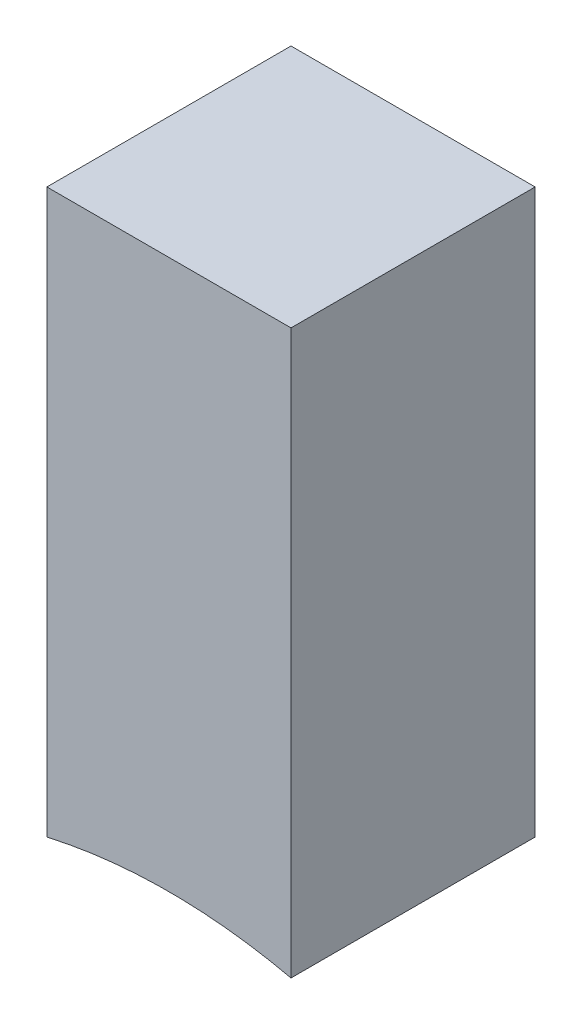
ISO-10303-21;
HEADER;
FILE_DESCRIPTION(('STEP AP214'),'2;1');
FILE_NAME('part.step','',(''),(''),'','','');
FILE_SCHEMA(('AUTOMOTIVE_DESIGN { 1 0 10303 214 1 1 1 1 }'));
ENDSEC;
DATA;
#1=APPLICATION_CONTEXT('core data for automotive mechanical design processes');
#2=APPLICATION_PROTOCOL_DEFINITION('international standard','automotive_design',2000,#1);
#3=PRODUCT_CONTEXT('',#1,'mechanical');
#4=PRODUCT('Part','Part','',(#3));
#5=PRODUCT_RELATED_PRODUCT_CATEGORY('part','',(#4));
#6=PRODUCT_DEFINITION_FORMATION('','',#4);
#7=PRODUCT_DEFINITION_CONTEXT('part definition',#1,'design');
#8=PRODUCT_DEFINITION('design','',#6,#7);
#9=PRODUCT_DEFINITION_SHAPE('','',#8);
#10=(LENGTH_UNIT() NAMED_UNIT(*) SI_UNIT(.MILLI.,.METRE.));
#11=(NAMED_UNIT(*) PLANE_ANGLE_UNIT() SI_UNIT($,.RADIAN.));
#12=(NAMED_UNIT(*) SI_UNIT($,.STERADIAN.) SOLID_ANGLE_UNIT());
#13=UNCERTAINTY_MEASURE_WITH_UNIT(LENGTH_MEASURE(1.E-05),#10,'distance_accuracy_value','');
#14=(GEOMETRIC_REPRESENTATION_CONTEXT(3) GLOBAL_UNCERTAINTY_ASSIGNED_CONTEXT((#13)) GLOBAL_UNIT_ASSIGNED_CONTEXT((#10,
#11,#12)) REPRESENTATION_CONTEXT('',''));
#15=CARTESIAN_POINT('',(0.,0.,0.));
#16=DIRECTION('',(0.,0.,1.));
#17=DIRECTION('',(1.,0.,0.));
#18=AXIS2_PLACEMENT_3D('',#15,#16,#17);
#19=CARTESIAN_POINT('',(2.,5.,4.));
#20=DIRECTION('',(-1.,0.,0.));
#21=DIRECTION('',(0.,-1.,0.));
#22=AXIS2_PLACEMENT_3D('',#19,#20,#21);
#23=PLANE('',#22);
#24=DIRECTION('',(0.,1.,0.));
#25=VECTOR('',#24,1.);
#26=CARTESIAN_POINT('',(2.,5.,4.));
#27=LINE('',#26,#25);
#28=CARTESIAN_POINT('',(2.,-4.22503561260788,4.));
#29=VERTEX_POINT('',#28);
#30=CARTESIAN_POINT('',(2.,5.,4.));
#31=VERTEX_POINT('',#30);
#32=EDGE_CURVE('E85',#29,#31,#27,.T.);
#33=ORIENTED_EDGE('',*,*,#32,.F.);
#34=DIRECTION('',(0.,0.,1.));
#35=VECTOR('',#34,1.);
#36=CARTESIAN_POINT('',(2.,-4.22503561260788,0.));
#37=LINE('',#36,#35);
#38=CARTESIAN_POINT('',(2.,-4.22503561260788,0.));
#39=VERTEX_POINT('',#38);
#40=EDGE_CURVE('E90',#29,#39,#37,.F.);
#41=ORIENTED_EDGE('',*,*,#40,.T.);
#42=DIRECTION('',(0.,1.,0.));
#43=VECTOR('',#42,1.);
#44=CARTESIAN_POINT('',(2.,5.,0.));
#45=LINE('',#44,#43);
#46=CARTESIAN_POINT('',(2.,5.,0.));
#47=VERTEX_POINT('',#46);
#48=EDGE_CURVE('E77',#39,#47,#45,.T.);
#49=ORIENTED_EDGE('',*,*,#48,.T.);
#50=DIRECTION('',(0.,0.,-1.));
#51=VECTOR('',#50,1.);
#52=CARTESIAN_POINT('',(2.,5.,4.));
#53=LINE('',#52,#51);
#54=EDGE_CURVE('E11',#31,#47,#53,.T.);
#55=ORIENTED_EDGE('',*,*,#54,.F.);
#56=EDGE_LOOP('',(#33,#41,#49,#55));
#57=FACE_BOUND('',#56,.T.);
#58=ADVANCED_FACE('F33',(#57),#23,.F.);
#59=CARTESIAN_POINT('',(-2.,5.,4.));
#60=DIRECTION('',(0.,-1.,0.));
#61=DIRECTION('',(0.,0.,-1.));
#62=AXIS2_PLACEMENT_3D('',#59,#60,#61);
#63=PLANE('',#62);
#64=DIRECTION('',(-1.,0.,0.));
#65=VECTOR('',#64,1.);
#66=CARTESIAN_POINT('',(-2.,5.,0.));
#67=LINE('',#66,#65);
#68=CARTESIAN_POINT('',(-2.,5.,0.));
#69=VERTEX_POINT('',#68);
#70=EDGE_CURVE('E68',#47,#69,#67,.T.);
#71=ORIENTED_EDGE('',*,*,#70,.T.);
#72=DIRECTION('',(0.,0.,-1.));
#73=VECTOR('',#72,1.);
#74=CARTESIAN_POINT('',(-2.,5.,4.));
#75=LINE('',#74,#73);
#76=CARTESIAN_POINT('',(-2.,5.,4.));
#77=VERTEX_POINT('',#76);
#78=EDGE_CURVE('E40',#77,#69,#75,.T.);
#79=ORIENTED_EDGE('',*,*,#78,.F.);
#80=DIRECTION('',(-1.,0.,0.));
#81=VECTOR('',#80,1.);
#82=CARTESIAN_POINT('',(-2.,5.,4.));
#83=LINE('',#82,#81);
#84=EDGE_CURVE('E56',#31,#77,#83,.T.);
#85=ORIENTED_EDGE('',*,*,#84,.F.);
#86=ORIENTED_EDGE('',*,*,#54,.T.);
#87=EDGE_LOOP('',(#71,#79,#85,#86));
#88=FACE_BOUND('',#87,.T.);
#89=ADVANCED_FACE('F70',(#88),#63,.F.);
#90=CARTESIAN_POINT('',(-2.,5.,4.));
#91=DIRECTION('',(1.,0.,0.));
#92=DIRECTION('',(0.,1.,0.));
#93=AXIS2_PLACEMENT_3D('',#90,#91,#92);
#94=PLANE('',#93);
#95=DIRECTION('',(0.,-1.,0.));
#96=VECTOR('',#95,1.);
#97=CARTESIAN_POINT('',(-2.,5.,0.));
#98=LINE('',#97,#96);
#99=CARTESIAN_POINT('',(-2.,-4.22503561260788,0.));
#100=VERTEX_POINT('',#99);
#101=EDGE_CURVE('E76',#69,#100,#98,.T.);
#102=ORIENTED_EDGE('',*,*,#101,.T.);
#103=DIRECTION('',(0.,0.,1.));
#104=VECTOR('',#103,1.);
#105=CARTESIAN_POINT('',(-2.,-4.22503561260788,0.));
#106=LINE('',#105,#104);
#107=CARTESIAN_POINT('',(-2.,-4.22503561260788,4.));
#108=VERTEX_POINT('',#107);
#109=EDGE_CURVE('E47',#100,#108,#106,.T.);
#110=ORIENTED_EDGE('',*,*,#109,.T.);
#111=DIRECTION('',(0.,-1.,0.));
#112=VECTOR('',#111,1.);
#113=CARTESIAN_POINT('',(-2.,5.,4.));
#114=LINE('',#113,#112);
#115=EDGE_CURVE('E82',#77,#108,#114,.T.);
#116=ORIENTED_EDGE('',*,*,#115,.F.);
#117=ORIENTED_EDGE('',*,*,#78,.T.);
#118=EDGE_LOOP('',(#102,#110,#116,#117));
#119=FACE_BOUND('',#118,.T.);
#120=ADVANCED_FACE('F81',(#119),#94,.F.);
#121=CARTESIAN_POINT('',(0.,0.,4.));
#122=DIRECTION('',(0.,0.,1.));
#123=DIRECTION('',(1.,0.,0.));
#124=AXIS2_PLACEMENT_3D('',#121,#122,#123);
#125=PLANE('',#124);
#126=CARTESIAN_POINT('',(0.,-13.,4.));
#127=DIRECTION('',(0.,0.,1.));
#128=DIRECTION('',(1.,0.,0.));
#129=AXIS2_PLACEMENT_3D('',#126,#127,#128);
#130=CIRCLE('',#129,9.);
#131=EDGE_CURVE('E96',#29,#108,#130,.T.);
#132=ORIENTED_EDGE('',*,*,#131,.F.);
#133=ORIENTED_EDGE('',*,*,#32,.T.);
#134=ORIENTED_EDGE('',*,*,#84,.T.);
#135=ORIENTED_EDGE('',*,*,#115,.T.);
#136=EDGE_LOOP('',(#132,#133,#134,#135));
#137=FACE_BOUND('',#136,.T.);
#138=ADVANCED_FACE('F103',(#137),#125,.T.);
#139=CARTESIAN_POINT('',(0.,0.,0.));
#140=DIRECTION('',(0.,0.,1.));
#141=DIRECTION('',(1.,0.,0.));
#142=AXIS2_PLACEMENT_3D('',#139,#140,#141);
#143=PLANE('',#142);
#144=ORIENTED_EDGE('',*,*,#48,.F.);
#145=CARTESIAN_POINT('',(0.,-13.,0.));
#146=DIRECTION('',(0.,0.,1.));
#147=DIRECTION('',(1.,0.,0.));
#148=AXIS2_PLACEMENT_3D('',#145,#146,#147);
#149=CIRCLE('',#148,9.);
#150=EDGE_CURVE('E84',#39,#100,#149,.T.);
#151=ORIENTED_EDGE('',*,*,#150,.T.);
#152=ORIENTED_EDGE('',*,*,#101,.F.);
#153=ORIENTED_EDGE('',*,*,#70,.F.);
#154=EDGE_LOOP('',(#144,#151,#152,#153));
#155=FACE_BOUND('',#154,.T.);
#156=ADVANCED_FACE('F83',(#155),#143,.F.);
#157=CARTESIAN_POINT('',(0.,-13.,0.));
#158=DIRECTION('',(0.,0.,1.));
#159=DIRECTION('',(1.,0.,0.));
#160=AXIS2_PLACEMENT_3D('',#157,#158,#159);
#161=CYLINDRICAL_SURFACE('',#160,9.);
#162=ORIENTED_EDGE('',*,*,#131,.T.);
#163=ORIENTED_EDGE('',*,*,#109,.F.);
#164=ORIENTED_EDGE('',*,*,#150,.F.);
#165=ORIENTED_EDGE('',*,*,#40,.F.);
#166=EDGE_LOOP('',(#162,#163,#164,#165));
#167=FACE_BOUND('',#166,.T.);
#168=ADVANCED_FACE('F100',(#167),#161,.F.);
#169=CLOSED_SHELL('',(#58,#89,#120,#138,#156,#168));
#170=MANIFOLD_SOLID_BREP('B2',#169);
#171=ADVANCED_BREP_SHAPE_REPRESENTATION('',(#18,#170),#14);
#172=SHAPE_DEFINITION_REPRESENTATION(#9,#171);
ENDSEC;
END-ISO-10303-21;
